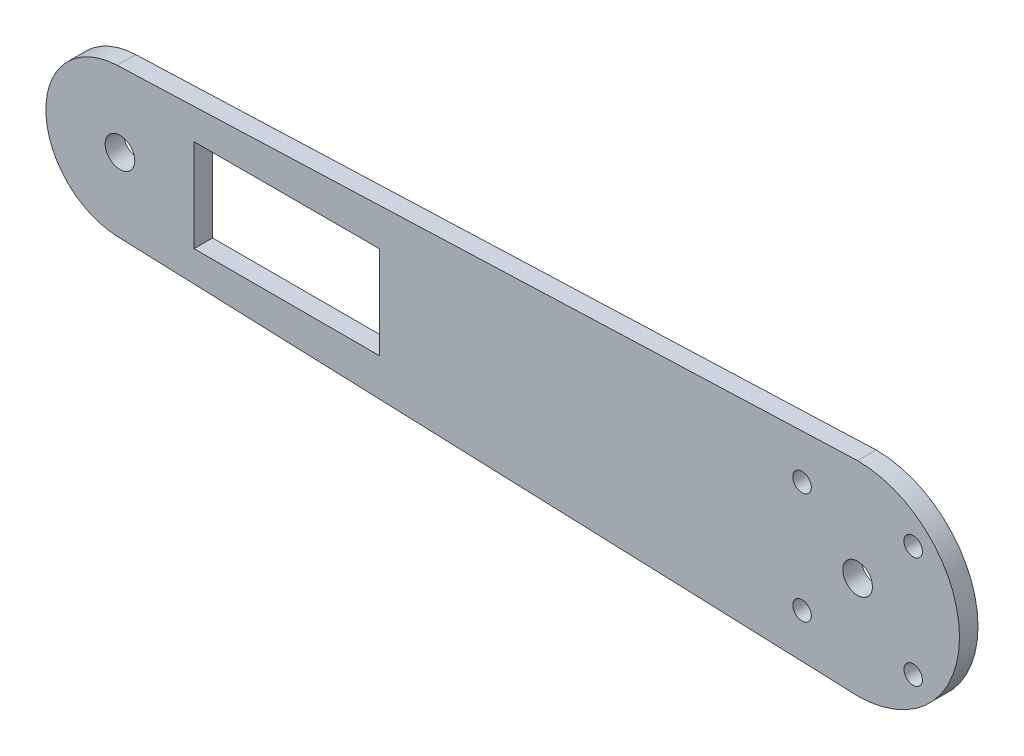
ISO-10303-21;
HEADER;
FILE_DESCRIPTION(('STEP AP214'),'2;1');
FILE_NAME('part.step','',(''),(''),'','','');
FILE_SCHEMA(('AUTOMOTIVE_DESIGN { 1 0 10303 214 1 1 1 1 }'));
ENDSEC;
DATA;
#1=APPLICATION_CONTEXT('core data for automotive mechanical design processes');
#2=APPLICATION_PROTOCOL_DEFINITION('international standard','automotive_design',2000,#1);
#3=PRODUCT_CONTEXT('',#1,'mechanical');
#4=PRODUCT('Part','Part','',(#3));
#5=PRODUCT_RELATED_PRODUCT_CATEGORY('part','',(#4));
#6=PRODUCT_DEFINITION_FORMATION('','',#4);
#7=PRODUCT_DEFINITION_CONTEXT('part definition',#1,'design');
#8=PRODUCT_DEFINITION('design','',#6,#7);
#9=PRODUCT_DEFINITION_SHAPE('','',#8);
#10=(LENGTH_UNIT() NAMED_UNIT(*) SI_UNIT(.MILLI.,.METRE.));
#11=(NAMED_UNIT(*) PLANE_ANGLE_UNIT() SI_UNIT($,.RADIAN.));
#12=(NAMED_UNIT(*) SI_UNIT($,.STERADIAN.) SOLID_ANGLE_UNIT());
#13=UNCERTAINTY_MEASURE_WITH_UNIT(LENGTH_MEASURE(1.E-05),#10,'distance_accuracy_value','');
#14=(GEOMETRIC_REPRESENTATION_CONTEXT(3) GLOBAL_UNCERTAINTY_ASSIGNED_CONTEXT((#13)) GLOBAL_UNIT_ASSIGNED_CONTEXT((#10,
#11,#12)) REPRESENTATION_CONTEXT('',''));
#15=CARTESIAN_POINT('',(0.,0.,0.));
#16=DIRECTION('',(0.,0.,1.));
#17=DIRECTION('',(1.,0.,0.));
#18=AXIS2_PLACEMENT_3D('',#15,#16,#17);
#19=CARTESIAN_POINT('',(-199.107383087619,0.,5.));
#20=DIRECTION('',(0.,0.,1.));
#21=DIRECTION('',(1.,0.,0.));
#22=AXIS2_PLACEMENT_3D('',#19,#20,#21);
#23=PLANE('',#22);
#24=DIRECTION('',(-1.,0.,0.));
#25=VECTOR('',#24,1.);
#26=CARTESIAN_POINT('',(-129.107383087619,12.5,5.));
#27=LINE('',#26,#25);
#28=CARTESIAN_POINT('',(-129.107383087619,12.5,5.));
#29=VERTEX_POINT('',#28);
#30=CARTESIAN_POINT('',(-179.107383087619,12.5,5.));
#31=VERTEX_POINT('',#30);
#32=EDGE_CURVE('E106',#29,#31,#27,.T.);
#33=ORIENTED_EDGE('',*,*,#32,.F.);
#34=DIRECTION('',(0.,1.,0.));
#35=VECTOR('',#34,1.);
#36=CARTESIAN_POINT('',(-129.107383087619,-12.5,5.));
#37=LINE('',#36,#35);
#38=CARTESIAN_POINT('',(-129.107383087619,-12.5,5.));
#39=VERTEX_POINT('',#38);
#40=EDGE_CURVE('E98',#39,#29,#37,.T.);
#41=ORIENTED_EDGE('',*,*,#40,.F.);
#42=DIRECTION('',(1.,0.,0.));
#43=VECTOR('',#42,1.);
#44=CARTESIAN_POINT('',(-129.107383087619,-12.5,5.));
#45=LINE('',#44,#43);
#46=CARTESIAN_POINT('',(-179.107383087619,-12.5,5.));
#47=VERTEX_POINT('',#46);
#48=EDGE_CURVE('E121',#47,#39,#45,.T.);
#49=ORIENTED_EDGE('',*,*,#48,.F.);
#50=DIRECTION('',(0.,-1.,0.));
#51=VECTOR('',#50,1.);
#52=CARTESIAN_POINT('',(-179.107383087619,-12.5,5.));
#53=LINE('',#52,#51);
#54=EDGE_CURVE('E119',#31,#47,#53,.T.);
#55=ORIENTED_EDGE('',*,*,#54,.F.);
#56=EDGE_LOOP('',(#33,#41,#49,#55));
#57=FACE_BOUND('',#56,.T.);
#58=CARTESIAN_POINT('',(-15.,15.,5.));
#59=DIRECTION('',(0.,0.,1.));
#60=DIRECTION('',(1.,0.,0.));
#61=AXIS2_PLACEMENT_3D('',#58,#59,#60);
#62=CIRCLE('',#61,2.5);
#63=CARTESIAN_POINT('',(-12.5,15.,5.));
#64=VERTEX_POINT('',#63);
#65=EDGE_CURVE('E137',#64,#64,#62,.T.);
#66=ORIENTED_EDGE('',*,*,#65,.F.);
#67=EDGE_LOOP('',(#66));
#68=FACE_BOUND('',#67,.T.);
#69=CARTESIAN_POINT('',(15.,15.,5.));
#70=DIRECTION('',(0.,0.,1.));
#71=DIRECTION('',(1.,0.,0.));
#72=AXIS2_PLACEMENT_3D('',#69,#70,#71);
#73=CIRCLE('',#72,2.5);
#74=CARTESIAN_POINT('',(17.5,15.,5.));
#75=VERTEX_POINT('',#74);
#76=EDGE_CURVE('E149',#75,#75,#73,.T.);
#77=ORIENTED_EDGE('',*,*,#76,.F.);
#78=EDGE_LOOP('',(#77));
#79=FACE_BOUND('',#78,.T.);
#80=CARTESIAN_POINT('',(-199.107383087619,0.,5.));
#81=DIRECTION('',(0.,0.,1.));
#82=DIRECTION('',(1.,0.,0.));
#83=AXIS2_PLACEMENT_3D('',#80,#81,#82);
#84=CIRCLE('',#83,3.99999999999999);
#85=CARTESIAN_POINT('',(-195.107383087619,0.,5.));
#86=VERTEX_POINT('',#85);
#87=EDGE_CURVE('E161',#86,#86,#84,.T.);
#88=ORIENTED_EDGE('',*,*,#87,.F.);
#89=EDGE_LOOP('',(#88));
#90=FACE_BOUND('',#89,.T.);
#91=CARTESIAN_POINT('',(-199.107383087619,0.,5.));
#92=DIRECTION('',(0.,0.,1.));
#93=DIRECTION('',(1.,0.,0.));
#94=AXIS2_PLACEMENT_3D('',#91,#92,#93);
#95=CIRCLE('',#94,20.);
#96=CARTESIAN_POINT('',(-199.858795136257,19.9858795136257,5.));
#97=VERTEX_POINT('',#96);
#98=CARTESIAN_POINT('',(-199.858795136257,-19.9858795136257,5.));
#99=VERTEX_POINT('',#98);
#100=EDGE_CURVE('E167',#97,#99,#95,.T.);
#101=ORIENTED_EDGE('',*,*,#100,.T.);
#102=DIRECTION('',(0.999293975681284,-0.0375706024318716,0.));
#103=VECTOR('',#102,1.);
#104=CARTESIAN_POINT('',(-199.858795136257,-19.9858795136257,5.));
#105=LINE('',#104,#103);
#106=CARTESIAN_POINT('',(0.,-27.5,5.));
#107=VERTEX_POINT('',#106);
#108=EDGE_CURVE('E170',#99,#107,#105,.T.);
#109=ORIENTED_EDGE('',*,*,#108,.T.);
#110=CARTESIAN_POINT('',(0.,0.,5.));
#111=DIRECTION('',(0.,0.,1.));
#112=DIRECTION('',(1.,0.,0.));
#113=AXIS2_PLACEMENT_3D('',#110,#111,#112);
#114=CIRCLE('',#113,27.5);
#115=CARTESIAN_POINT('',(0.,27.5,5.));
#116=VERTEX_POINT('',#115);
#117=EDGE_CURVE('E173',#107,#116,#114,.T.);
#118=ORIENTED_EDGE('',*,*,#117,.T.);
#119=DIRECTION('',(-0.999293975681284,-0.0375706024318716,0.));
#120=VECTOR('',#119,1.);
#121=CARTESIAN_POINT('',(0.,27.5,5.));
#122=LINE('',#121,#120);
#123=EDGE_CURVE('E175',#116,#97,#122,.T.);
#124=ORIENTED_EDGE('',*,*,#123,.T.);
#125=EDGE_LOOP('',(#101,#109,#118,#124));
#126=FACE_BOUND('',#125,.T.);
#127=CARTESIAN_POINT('',(-15.,-15.,5.));
#128=DIRECTION('',(0.,0.,1.));
#129=DIRECTION('',(1.,0.,0.));
#130=AXIS2_PLACEMENT_3D('',#127,#128,#129);
#131=CIRCLE('',#130,2.5);
#132=CARTESIAN_POINT('',(-12.5,-15.,5.));
#133=VERTEX_POINT('',#132);
#134=EDGE_CURVE('E155',#133,#133,#131,.T.);
#135=ORIENTED_EDGE('',*,*,#134,.F.);
#136=EDGE_LOOP('',(#135));
#137=FACE_BOUND('',#136,.T.);
#138=CARTESIAN_POINT('',(15.,-15.,5.));
#139=DIRECTION('',(0.,0.,1.));
#140=DIRECTION('',(1.,0.,0.));
#141=AXIS2_PLACEMENT_3D('',#138,#139,#140);
#142=CIRCLE('',#141,2.5);
#143=CARTESIAN_POINT('',(17.5,-15.,5.));
#144=VERTEX_POINT('',#143);
#145=EDGE_CURVE('E143',#144,#144,#142,.T.);
#146=ORIENTED_EDGE('',*,*,#145,.F.);
#147=EDGE_LOOP('',(#146));
#148=FACE_BOUND('',#147,.T.);
#149=CARTESIAN_POINT('',(0.,0.,5.));
#150=DIRECTION('',(0.,0.,1.));
#151=DIRECTION('',(1.,0.,0.));
#152=AXIS2_PLACEMENT_3D('',#149,#150,#151);
#153=CIRCLE('',#152,4.);
#154=CARTESIAN_POINT('',(4.,0.,5.));
#155=VERTEX_POINT('',#154);
#156=EDGE_CURVE('E127',#155,#155,#153,.T.);
#157=ORIENTED_EDGE('',*,*,#156,.F.);
#158=EDGE_LOOP('',(#157));
#159=FACE_BOUND('',#158,.T.);
#160=ADVANCED_FACE('F33',(#57,#68,#79,#90,#126,#137,#148,#159),#23,.T.);
#161=CARTESIAN_POINT('',(-199.107383087619,0.,0.));
#162=DIRECTION('',(0.,0.,1.));
#163=DIRECTION('',(1.,0.,0.));
#164=AXIS2_PLACEMENT_3D('',#161,#162,#163);
#165=PLANE('',#164);
#166=CARTESIAN_POINT('',(-15.,15.,0.));
#167=DIRECTION('',(0.,0.,1.));
#168=DIRECTION('',(1.,0.,0.));
#169=AXIS2_PLACEMENT_3D('',#166,#167,#168);
#170=CIRCLE('',#169,2.5);
#171=CARTESIAN_POINT('',(-12.5,15.,0.));
#172=VERTEX_POINT('',#171);
#173=EDGE_CURVE('E114',#172,#172,#170,.T.);
#174=ORIENTED_EDGE('',*,*,#173,.T.);
#175=EDGE_LOOP('',(#174));
#176=FACE_BOUND('',#175,.T.);
#177=CARTESIAN_POINT('',(15.,-15.,0.));
#178=DIRECTION('',(0.,0.,1.));
#179=DIRECTION('',(1.,0.,0.));
#180=AXIS2_PLACEMENT_3D('',#177,#178,#179);
#181=CIRCLE('',#180,2.5);
#182=CARTESIAN_POINT('',(17.5,-15.,0.));
#183=VERTEX_POINT('',#182);
#184=EDGE_CURVE('E140',#183,#183,#181,.T.);
#185=ORIENTED_EDGE('',*,*,#184,.T.);
#186=EDGE_LOOP('',(#185));
#187=FACE_BOUND('',#186,.T.);
#188=CARTESIAN_POINT('',(15.,15.,0.));
#189=DIRECTION('',(0.,0.,1.));
#190=DIRECTION('',(1.,0.,0.));
#191=AXIS2_PLACEMENT_3D('',#188,#189,#190);
#192=CIRCLE('',#191,2.5);
#193=CARTESIAN_POINT('',(17.5,15.,0.));
#194=VERTEX_POINT('',#193);
#195=EDGE_CURVE('E146',#194,#194,#192,.T.);
#196=ORIENTED_EDGE('',*,*,#195,.T.);
#197=EDGE_LOOP('',(#196));
#198=FACE_BOUND('',#197,.T.);
#199=CARTESIAN_POINT('',(-15.,-15.,0.));
#200=DIRECTION('',(0.,0.,1.));
#201=DIRECTION('',(1.,0.,0.));
#202=AXIS2_PLACEMENT_3D('',#199,#200,#201);
#203=CIRCLE('',#202,2.5);
#204=CARTESIAN_POINT('',(-12.5,-15.,0.));
#205=VERTEX_POINT('',#204);
#206=EDGE_CURVE('E152',#205,#205,#203,.T.);
#207=ORIENTED_EDGE('',*,*,#206,.T.);
#208=EDGE_LOOP('',(#207));
#209=FACE_BOUND('',#208,.T.);
#210=CARTESIAN_POINT('',(-199.107383087619,0.,0.));
#211=DIRECTION('',(0.,0.,1.));
#212=DIRECTION('',(1.,0.,0.));
#213=AXIS2_PLACEMENT_3D('',#210,#211,#212);
#214=CIRCLE('',#213,3.99999999999999);
#215=CARTESIAN_POINT('',(-195.107383087619,0.,0.));
#216=VERTEX_POINT('',#215);
#217=EDGE_CURVE('E158',#216,#216,#214,.T.);
#218=ORIENTED_EDGE('',*,*,#217,.T.);
#219=EDGE_LOOP('',(#218));
#220=FACE_BOUND('',#219,.T.);
#221=CARTESIAN_POINT('',(-199.107383087619,0.,0.));
#222=DIRECTION('',(0.,0.,1.));
#223=DIRECTION('',(1.,0.,0.));
#224=AXIS2_PLACEMENT_3D('',#221,#222,#223);
#225=CIRCLE('',#224,20.);
#226=CARTESIAN_POINT('',(-199.858795136257,19.9858795136257,0.));
#227=VERTEX_POINT('',#226);
#228=CARTESIAN_POINT('',(-199.858795136257,-19.9858795136257,0.));
#229=VERTEX_POINT('',#228);
#230=EDGE_CURVE('E164',#227,#229,#225,.T.);
#231=ORIENTED_EDGE('',*,*,#230,.F.);
#232=DIRECTION('',(-0.999293975681284,-0.0375706024318716,0.));
#233=VECTOR('',#232,1.);
#234=CARTESIAN_POINT('',(0.,27.5,0.));
#235=LINE('',#234,#233);
#236=CARTESIAN_POINT('',(0.,27.5,0.));
#237=VERTEX_POINT('',#236);
#238=EDGE_CURVE('E171',#237,#227,#235,.T.);
#239=ORIENTED_EDGE('',*,*,#238,.F.);
#240=CARTESIAN_POINT('',(0.,0.,0.));
#241=DIRECTION('',(0.,0.,1.));
#242=DIRECTION('',(1.,0.,0.));
#243=AXIS2_PLACEMENT_3D('',#240,#241,#242);
#244=CIRCLE('',#243,27.5);
#245=CARTESIAN_POINT('',(0.,-27.5,0.));
#246=VERTEX_POINT('',#245);
#247=EDGE_CURVE('E182',#246,#237,#244,.T.);
#248=ORIENTED_EDGE('',*,*,#247,.F.);
#249=DIRECTION('',(0.999293975681284,-0.0375706024318716,0.));
#250=VECTOR('',#249,1.);
#251=CARTESIAN_POINT('',(-199.858795136257,-19.9858795136257,0.));
#252=LINE('',#251,#250);
#253=EDGE_CURVE('E180',#229,#246,#252,.T.);
#254=ORIENTED_EDGE('',*,*,#253,.F.);
#255=EDGE_LOOP('',(#231,#239,#248,#254));
#256=FACE_BOUND('',#255,.T.);
#257=DIRECTION('',(0.,1.,0.));
#258=VECTOR('',#257,1.);
#259=CARTESIAN_POINT('',(-129.107383087619,-12.5,0.));
#260=LINE('',#259,#258);
#261=CARTESIAN_POINT('',(-129.107383087619,-12.5,0.));
#262=VERTEX_POINT('',#261);
#263=CARTESIAN_POINT('',(-129.107383087619,12.5,0.));
#264=VERTEX_POINT('',#263);
#265=EDGE_CURVE('E56',#262,#264,#260,.T.);
#266=ORIENTED_EDGE('',*,*,#265,.T.);
#267=DIRECTION('',(-1.,0.,0.));
#268=VECTOR('',#267,1.);
#269=CARTESIAN_POINT('',(-129.107383087619,12.5,0.));
#270=LINE('',#269,#268);
#271=CARTESIAN_POINT('',(-179.107383087619,12.5,0.));
#272=VERTEX_POINT('',#271);
#273=EDGE_CURVE('E113',#264,#272,#270,.T.);
#274=ORIENTED_EDGE('',*,*,#273,.T.);
#275=DIRECTION('',(0.,-1.,0.));
#276=VECTOR('',#275,1.);
#277=CARTESIAN_POINT('',(-179.107383087619,-12.5,0.));
#278=LINE('',#277,#276);
#279=CARTESIAN_POINT('',(-179.107383087619,-12.5,0.));
#280=VERTEX_POINT('',#279);
#281=EDGE_CURVE('E129',#272,#280,#278,.T.);
#282=ORIENTED_EDGE('',*,*,#281,.T.);
#283=DIRECTION('',(1.,0.,0.));
#284=VECTOR('',#283,1.);
#285=CARTESIAN_POINT('',(-129.107383087619,-12.5,0.));
#286=LINE('',#285,#284);
#287=EDGE_CURVE('E107',#280,#262,#286,.T.);
#288=ORIENTED_EDGE('',*,*,#287,.T.);
#289=EDGE_LOOP('',(#266,#274,#282,#288));
#290=FACE_BOUND('',#289,.T.);
#291=CARTESIAN_POINT('',(0.,0.,0.));
#292=DIRECTION('',(0.,0.,1.));
#293=DIRECTION('',(1.,0.,0.));
#294=AXIS2_PLACEMENT_3D('',#291,#292,#293);
#295=CIRCLE('',#294,4.);
#296=CARTESIAN_POINT('',(4.,0.,0.));
#297=VERTEX_POINT('',#296);
#298=EDGE_CURVE('E281',#297,#297,#295,.T.);
#299=ORIENTED_EDGE('',*,*,#298,.T.);
#300=EDGE_LOOP('',(#299));
#301=FACE_BOUND('',#300,.T.);
#302=ADVANCED_FACE('F200',(#176,#187,#198,#209,#220,#256,#290,#301),#165,.F.);
#303=CARTESIAN_POINT('',(-199.107383087619,0.,5.));
#304=DIRECTION('',(0.,0.,-1.));
#305=DIRECTION('',(-1.,0.,0.));
#306=AXIS2_PLACEMENT_3D('',#303,#304,#305);
#307=CYLINDRICAL_SURFACE('',#306,20.);
#308=ORIENTED_EDGE('',*,*,#230,.T.);
#309=DIRECTION('',(0.,0.,-1.));
#310=VECTOR('',#309,1.);
#311=CARTESIAN_POINT('',(-199.858795136257,-19.9858795136257,5.));
#312=LINE('',#311,#310);
#313=EDGE_CURVE('E11',#99,#229,#312,.T.);
#314=ORIENTED_EDGE('',*,*,#313,.F.);
#315=ORIENTED_EDGE('',*,*,#100,.F.);
#316=DIRECTION('',(0.,0.,-1.));
#317=VECTOR('',#316,1.);
#318=CARTESIAN_POINT('',(-199.858795136257,19.9858795136257,5.));
#319=LINE('',#318,#317);
#320=EDGE_CURVE('E177',#97,#227,#319,.T.);
#321=ORIENTED_EDGE('',*,*,#320,.T.);
#322=EDGE_LOOP('',(#308,#314,#315,#321));
#323=FACE_BOUND('',#322,.T.);
#324=ADVANCED_FACE('F35',(#323),#307,.T.);
#325=CARTESIAN_POINT('',(-199.858795136257,-19.9858795136257,5.));
#326=DIRECTION('',(0.0375706024318716,0.999293975681284,0.));
#327=DIRECTION('',(-0.999293975681284,0.0375706024318716,0.));
#328=AXIS2_PLACEMENT_3D('',#325,#326,#327);
#329=PLANE('',#328);
#330=ORIENTED_EDGE('',*,*,#253,.T.);
#331=DIRECTION('',(0.,0.,-1.));
#332=VECTOR('',#331,1.);
#333=CARTESIAN_POINT('',(0.,-27.5,5.));
#334=LINE('',#333,#332);
#335=EDGE_CURVE('E41',#107,#246,#334,.T.);
#336=ORIENTED_EDGE('',*,*,#335,.F.);
#337=ORIENTED_EDGE('',*,*,#108,.F.);
#338=ORIENTED_EDGE('',*,*,#313,.T.);
#339=EDGE_LOOP('',(#330,#336,#337,#338));
#340=FACE_BOUND('',#339,.T.);
#341=ADVANCED_FACE('F211',(#340),#329,.F.);
#342=CARTESIAN_POINT('',(0.,0.,5.));
#343=DIRECTION('',(0.,0.,-1.));
#344=DIRECTION('',(-1.,0.,0.));
#345=AXIS2_PLACEMENT_3D('',#342,#343,#344);
#346=CYLINDRICAL_SURFACE('',#345,27.5);
#347=ORIENTED_EDGE('',*,*,#247,.T.);
#348=DIRECTION('',(0.,0.,-1.));
#349=VECTOR('',#348,1.);
#350=CARTESIAN_POINT('',(0.,27.5,5.));
#351=LINE('',#350,#349);
#352=EDGE_CURVE('E187',#116,#237,#351,.T.);
#353=ORIENTED_EDGE('',*,*,#352,.F.);
#354=ORIENTED_EDGE('',*,*,#117,.F.);
#355=ORIENTED_EDGE('',*,*,#335,.T.);
#356=EDGE_LOOP('',(#347,#353,#354,#355));
#357=FACE_BOUND('',#356,.T.);
#358=ADVANCED_FACE('F194',(#357),#346,.T.);
#359=CARTESIAN_POINT('',(0.,27.5,5.));
#360=DIRECTION('',(0.0375706024318716,-0.999293975681284,0.));
#361=DIRECTION('',(0.999293975681284,0.0375706024318716,0.));
#362=AXIS2_PLACEMENT_3D('',#359,#360,#361);
#363=PLANE('',#362);
#364=ORIENTED_EDGE('',*,*,#238,.T.);
#365=ORIENTED_EDGE('',*,*,#320,.F.);
#366=ORIENTED_EDGE('',*,*,#123,.F.);
#367=ORIENTED_EDGE('',*,*,#352,.T.);
#368=EDGE_LOOP('',(#364,#365,#366,#367));
#369=FACE_BOUND('',#368,.T.);
#370=ADVANCED_FACE('F204',(#369),#363,.F.);
#371=CARTESIAN_POINT('',(-199.107383087619,0.,5.));
#372=DIRECTION('',(0.,0.,-1.));
#373=DIRECTION('',(-1.,0.,0.));
#374=AXIS2_PLACEMENT_3D('',#371,#372,#373);
#375=CYLINDRICAL_SURFACE('',#374,3.99999999999999);
#376=ORIENTED_EDGE('',*,*,#87,.T.);
#377=EDGE_LOOP('',(#376));
#378=FACE_BOUND('',#377,.T.);
#379=ORIENTED_EDGE('',*,*,#217,.F.);
#380=EDGE_LOOP('',(#379));
#381=FACE_BOUND('',#380,.T.);
#382=ADVANCED_FACE('F226',(#378,#381),#375,.F.);
#383=CARTESIAN_POINT('',(-15.,-15.,5.));
#384=DIRECTION('',(0.,0.,-1.));
#385=DIRECTION('',(-1.,0.,0.));
#386=AXIS2_PLACEMENT_3D('',#383,#384,#385);
#387=CYLINDRICAL_SURFACE('',#386,2.5);
#388=ORIENTED_EDGE('',*,*,#134,.T.);
#389=EDGE_LOOP('',(#388));
#390=FACE_BOUND('',#389,.T.);
#391=ORIENTED_EDGE('',*,*,#206,.F.);
#392=EDGE_LOOP('',(#391));
#393=FACE_BOUND('',#392,.T.);
#394=ADVANCED_FACE('F233',(#390,#393),#387,.F.);
#395=CARTESIAN_POINT('',(15.,15.,5.));
#396=DIRECTION('',(0.,0.,-1.));
#397=DIRECTION('',(-1.,0.,0.));
#398=AXIS2_PLACEMENT_3D('',#395,#396,#397);
#399=CYLINDRICAL_SURFACE('',#398,2.5);
#400=ORIENTED_EDGE('',*,*,#76,.T.);
#401=EDGE_LOOP('',(#400));
#402=FACE_BOUND('',#401,.T.);
#403=ORIENTED_EDGE('',*,*,#195,.F.);
#404=EDGE_LOOP('',(#403));
#405=FACE_BOUND('',#404,.T.);
#406=ADVANCED_FACE('F238',(#402,#405),#399,.F.);
#407=CARTESIAN_POINT('',(15.,-15.,5.));
#408=DIRECTION('',(0.,0.,-1.));
#409=DIRECTION('',(-1.,0.,0.));
#410=AXIS2_PLACEMENT_3D('',#407,#408,#409);
#411=CYLINDRICAL_SURFACE('',#410,2.5);
#412=ORIENTED_EDGE('',*,*,#145,.T.);
#413=EDGE_LOOP('',(#412));
#414=FACE_BOUND('',#413,.T.);
#415=ORIENTED_EDGE('',*,*,#184,.F.);
#416=EDGE_LOOP('',(#415));
#417=FACE_BOUND('',#416,.T.);
#418=ADVANCED_FACE('F248',(#414,#417),#411,.F.);
#419=CARTESIAN_POINT('',(-15.,15.,5.));
#420=DIRECTION('',(0.,0.,-1.));
#421=DIRECTION('',(-1.,0.,0.));
#422=AXIS2_PLACEMENT_3D('',#419,#420,#421);
#423=CYLINDRICAL_SURFACE('',#422,2.5);
#424=ORIENTED_EDGE('',*,*,#65,.T.);
#425=EDGE_LOOP('',(#424));
#426=FACE_BOUND('',#425,.T.);
#427=ORIENTED_EDGE('',*,*,#173,.F.);
#428=EDGE_LOOP('',(#427));
#429=FACE_BOUND('',#428,.T.);
#430=ADVANCED_FACE('F255',(#426,#429),#423,.F.);
#431=CARTESIAN_POINT('',(-129.107383087619,-12.5,5.));
#432=DIRECTION('',(-1.,0.,0.));
#433=DIRECTION('',(0.,-1.,0.));
#434=AXIS2_PLACEMENT_3D('',#431,#432,#433);
#435=PLANE('',#434);
#436=ORIENTED_EDGE('',*,*,#265,.F.);
#437=DIRECTION('',(0.,0.,-1.));
#438=VECTOR('',#437,1.);
#439=CARTESIAN_POINT('',(-129.107383087619,-12.5,5.));
#440=LINE('',#439,#438);
#441=EDGE_CURVE('E102',#39,#262,#440,.T.);
#442=ORIENTED_EDGE('',*,*,#441,.F.);
#443=ORIENTED_EDGE('',*,*,#40,.T.);
#444=DIRECTION('',(0.,0.,-1.));
#445=VECTOR('',#444,1.);
#446=CARTESIAN_POINT('',(-129.107383087619,12.5,5.));
#447=LINE('',#446,#445);
#448=EDGE_CURVE('E101',#29,#264,#447,.T.);
#449=ORIENTED_EDGE('',*,*,#448,.T.);
#450=EDGE_LOOP('',(#436,#442,#443,#449));
#451=FACE_BOUND('',#450,.T.);
#452=ADVANCED_FACE('F100',(#451),#435,.T.);
#453=CARTESIAN_POINT('',(-129.107383087619,12.5,5.));
#454=DIRECTION('',(0.,-1.,0.));
#455=DIRECTION('',(1.,0.,0.));
#456=AXIS2_PLACEMENT_3D('',#453,#454,#455);
#457=PLANE('',#456);
#458=ORIENTED_EDGE('',*,*,#273,.F.);
#459=ORIENTED_EDGE('',*,*,#448,.F.);
#460=ORIENTED_EDGE('',*,*,#32,.T.);
#461=DIRECTION('',(0.,0.,-1.));
#462=VECTOR('',#461,1.);
#463=CARTESIAN_POINT('',(-179.107383087619,12.5,5.));
#464=LINE('',#463,#462);
#465=EDGE_CURVE('E115',#31,#272,#464,.T.);
#466=ORIENTED_EDGE('',*,*,#465,.T.);
#467=EDGE_LOOP('',(#458,#459,#460,#466));
#468=FACE_BOUND('',#467,.T.);
#469=ADVANCED_FACE('F110',(#468),#457,.T.);
#470=CARTESIAN_POINT('',(-179.107383087619,-12.5,5.));
#471=DIRECTION('',(1.,0.,0.));
#472=DIRECTION('',(0.,0.,-1.));
#473=AXIS2_PLACEMENT_3D('',#470,#471,#472);
#474=PLANE('',#473);
#475=ORIENTED_EDGE('',*,*,#281,.F.);
#476=ORIENTED_EDGE('',*,*,#465,.F.);
#477=ORIENTED_EDGE('',*,*,#54,.T.);
#478=DIRECTION('',(0.,0.,-1.));
#479=VECTOR('',#478,1.);
#480=CARTESIAN_POINT('',(-179.107383087619,-12.5,5.));
#481=LINE('',#480,#479);
#482=EDGE_CURVE('E48',#47,#280,#481,.T.);
#483=ORIENTED_EDGE('',*,*,#482,.T.);
#484=EDGE_LOOP('',(#475,#476,#477,#483));
#485=FACE_BOUND('',#484,.T.);
#486=ADVANCED_FACE('F264',(#485),#474,.T.);
#487=CARTESIAN_POINT('',(-129.107383087619,-12.5,5.));
#488=DIRECTION('',(0.,1.,0.));
#489=DIRECTION('',(-1.,0.,0.));
#490=AXIS2_PLACEMENT_3D('',#487,#488,#489);
#491=PLANE('',#490);
#492=ORIENTED_EDGE('',*,*,#287,.F.);
#493=ORIENTED_EDGE('',*,*,#482,.F.);
#494=ORIENTED_EDGE('',*,*,#48,.T.);
#495=ORIENTED_EDGE('',*,*,#441,.T.);
#496=EDGE_LOOP('',(#492,#493,#494,#495));
#497=FACE_BOUND('',#496,.T.);
#498=ADVANCED_FACE('F267',(#497),#491,.T.);
#499=CARTESIAN_POINT('',(0.,0.,5.));
#500=DIRECTION('',(0.,0.,-1.));
#501=DIRECTION('',(-1.,0.,0.));
#502=AXIS2_PLACEMENT_3D('',#499,#500,#501);
#503=CYLINDRICAL_SURFACE('',#502,4.);
#504=ORIENTED_EDGE('',*,*,#156,.T.);
#505=EDGE_LOOP('',(#504));
#506=FACE_BOUND('',#505,.T.);
#507=ORIENTED_EDGE('',*,*,#298,.F.);
#508=EDGE_LOOP('',(#507));
#509=FACE_BOUND('',#508,.T.);
#510=ADVANCED_FACE('F271',(#506,#509),#503,.F.);
#511=CLOSED_SHELL('',(#160,#302,#324,#341,#358,#370,#382,#394,#406,#418,#430,#452,#469,#486,
#498,#510));
#512=MANIFOLD_SOLID_BREP('B2',#511);
#513=ADVANCED_BREP_SHAPE_REPRESENTATION('',(#18,#512),#14);
#514=SHAPE_DEFINITION_REPRESENTATION(#9,#513);
ENDSEC;
END-ISO-10303-21;
